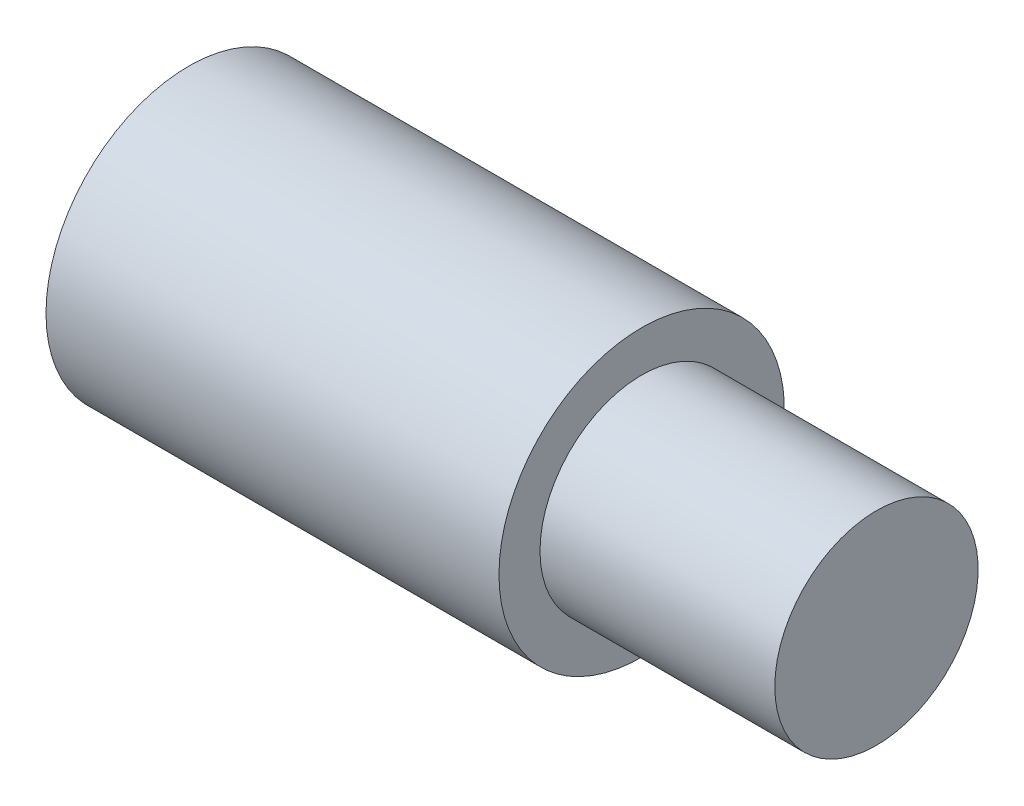
ISO-10303-21;
HEADER;
FILE_DESCRIPTION(('STEP AP214'),'2;1');
FILE_NAME('part.step','',(''),(''),'','','');
FILE_SCHEMA(('AUTOMOTIVE_DESIGN { 1 0 10303 214 1 1 1 1 }'));
ENDSEC;
DATA;
#1=APPLICATION_CONTEXT('core data for automotive mechanical design processes');
#2=APPLICATION_PROTOCOL_DEFINITION('international standard','automotive_design',2000,#1);
#3=PRODUCT_CONTEXT('',#1,'mechanical');
#4=PRODUCT('Part','Part','',(#3));
#5=PRODUCT_RELATED_PRODUCT_CATEGORY('part','',(#4));
#6=PRODUCT_DEFINITION_FORMATION('','',#4);
#7=PRODUCT_DEFINITION_CONTEXT('part definition',#1,'design');
#8=PRODUCT_DEFINITION('design','',#6,#7);
#9=PRODUCT_DEFINITION_SHAPE('','',#8);
#10=(LENGTH_UNIT() NAMED_UNIT(*) SI_UNIT(.MILLI.,.METRE.));
#11=(NAMED_UNIT(*) PLANE_ANGLE_UNIT() SI_UNIT($,.RADIAN.));
#12=(NAMED_UNIT(*) SI_UNIT($,.STERADIAN.) SOLID_ANGLE_UNIT());
#13=UNCERTAINTY_MEASURE_WITH_UNIT(LENGTH_MEASURE(1.E-05),#10,'distance_accuracy_value','');
#14=(GEOMETRIC_REPRESENTATION_CONTEXT(3) GLOBAL_UNCERTAINTY_ASSIGNED_CONTEXT((#13)) GLOBAL_UNIT_ASSIGNED_CONTEXT((#10,
#11,#12)) REPRESENTATION_CONTEXT('',''));
#15=CARTESIAN_POINT('',(0.,0.,0.));
#16=DIRECTION('',(0.,0.,1.));
#17=DIRECTION('',(1.,0.,0.));
#18=AXIS2_PLACEMENT_3D('',#15,#16,#17);
#19=CARTESIAN_POINT('',(12.7,0.,0.));
#20=DIRECTION('',(-1.,0.,0.));
#21=DIRECTION('',(0.,0.,1.));
#22=AXIS2_PLACEMENT_3D('',#19,#20,#21);
#23=PLANE('',#22);
#24=CARTESIAN_POINT('',(12.6999999999999,0.,0.));
#25=DIRECTION('',(-1.,0.,0.));
#26=DIRECTION('',(0.,0.,1.));
#27=AXIS2_PLACEMENT_3D('',#24,#25,#26);
#28=CIRCLE('',#27,5.5);
#29=CARTESIAN_POINT('',(12.6999999999999,0.,5.5));
#30=VERTEX_POINT('',#29);
#31=EDGE_CURVE('E10',#30,#30,#28,.T.);
#32=ORIENTED_EDGE('',*,*,#31,.F.);
#33=EDGE_LOOP('',(#32));
#34=FACE_BOUND('',#33,.T.);
#35=ADVANCED_FACE('F39',(#34),#23,.F.);
#36=CARTESIAN_POINT('',(-1000.,0.,0.));
#37=DIRECTION('',(-1.,0.,0.));
#38=DIRECTION('',(0.,0.,1.));
#39=AXIS2_PLACEMENT_3D('',#36,#37,#38);
#40=CYLINDRICAL_SURFACE('',#39,5.5);
#41=CARTESIAN_POINT('',(0.,0.,0.));
#42=DIRECTION('',(-1.,0.,0.));
#43=DIRECTION('',(0.,0.,1.));
#44=AXIS2_PLACEMENT_3D('',#41,#42,#43);
#45=CIRCLE('',#44,5.5);
#46=CARTESIAN_POINT('',(0.,0.,5.5));
#47=VERTEX_POINT('',#46);
#48=EDGE_CURVE('E46',#47,#47,#45,.T.);
#49=ORIENTED_EDGE('',*,*,#48,.F.);
#50=EDGE_LOOP('',(#49));
#51=FACE_BOUND('',#50,.T.);
#52=ORIENTED_EDGE('',*,*,#31,.T.);
#53=EDGE_LOOP('',(#52));
#54=FACE_BOUND('',#53,.T.);
#55=ADVANCED_FACE('F84',(#51,#54),#40,.T.);
#56=CARTESIAN_POINT('',(0.,5.5,0.));
#57=DIRECTION('',(-1.,0.,0.));
#58=DIRECTION('',(0.,0.,1.));
#59=AXIS2_PLACEMENT_3D('',#56,#57,#58);
#60=PLANE('',#59);
#61=CARTESIAN_POINT('',(0.,0.,0.));
#62=DIRECTION('',(-1.,0.,0.));
#63=DIRECTION('',(0.,0.,1.));
#64=AXIS2_PLACEMENT_3D('',#61,#62,#63);
#65=CIRCLE('',#64,7.72);
#66=CARTESIAN_POINT('',(0.,0.,7.72));
#67=VERTEX_POINT('',#66);
#68=EDGE_CURVE('E49',#67,#67,#65,.T.);
#69=ORIENTED_EDGE('',*,*,#68,.F.);
#70=EDGE_LOOP('',(#69));
#71=FACE_BOUND('',#70,.T.);
#72=ORIENTED_EDGE('',*,*,#48,.T.);
#73=EDGE_LOOP('',(#72));
#74=FACE_BOUND('',#73,.T.);
#75=ADVANCED_FACE('F76',(#71,#74),#60,.F.);
#76=CARTESIAN_POINT('',(-1000.,0.,0.));
#77=DIRECTION('',(-1.,0.,0.));
#78=DIRECTION('',(0.,0.,1.));
#79=AXIS2_PLACEMENT_3D('',#76,#77,#78);
#80=CYLINDRICAL_SURFACE('',#79,7.72);
#81=CARTESIAN_POINT('',(-24.5,0.,0.));
#82=DIRECTION('',(-1.,0.,0.));
#83=DIRECTION('',(0.,0.,1.));
#84=AXIS2_PLACEMENT_3D('',#81,#82,#83);
#85=CIRCLE('',#84,7.72);
#86=CARTESIAN_POINT('',(-24.5,0.,7.72));
#87=VERTEX_POINT('',#86);
#88=EDGE_CURVE('E54',#87,#87,#85,.T.);
#89=ORIENTED_EDGE('',*,*,#88,.F.);
#90=EDGE_LOOP('',(#89));
#91=FACE_BOUND('',#90,.T.);
#92=ORIENTED_EDGE('',*,*,#68,.T.);
#93=EDGE_LOOP('',(#92));
#94=FACE_BOUND('',#93,.T.);
#95=ADVANCED_FACE('F68',(#91,#94),#80,.T.);
#96=CARTESIAN_POINT('',(-24.5,7.72,0.));
#97=DIRECTION('',(1.,0.,0.));
#98=DIRECTION('',(0.,0.,-1.));
#99=AXIS2_PLACEMENT_3D('',#96,#97,#98);
#100=PLANE('',#99);
#101=CARTESIAN_POINT('',(-24.5,0.,0.));
#102=DIRECTION('',(1.,0.,0.));
#103=DIRECTION('',(0.,0.,-1.));
#104=AXIS2_PLACEMENT_3D('',#101,#102,#103);
#105=CIRCLE('',#104,3.175);
#106=CARTESIAN_POINT('',(-24.5,0.,-3.175));
#107=VERTEX_POINT('',#106);
#108=EDGE_CURVE('E45',#107,#107,#105,.F.);
#109=ORIENTED_EDGE('',*,*,#108,.F.);
#110=EDGE_LOOP('',(#109));
#111=FACE_BOUND('',#110,.T.);
#112=ORIENTED_EDGE('',*,*,#88,.T.);
#113=EDGE_LOOP('',(#112));
#114=FACE_BOUND('',#113,.T.);
#115=ADVANCED_FACE('F69',(#111,#114),#100,.F.);
#116=CARTESIAN_POINT('',(-1000.,0.,0.));
#117=DIRECTION('',(-1.,0.,0.));
#118=DIRECTION('',(0.,0.,1.));
#119=AXIS2_PLACEMENT_3D('',#116,#117,#118);
#120=CYLINDRICAL_SURFACE('',#119,3.175);
#121=CARTESIAN_POINT('',(-9.29999999999998,0.,0.));
#122=DIRECTION('',(-1.,0.,0.));
#123=DIRECTION('',(0.,0.,1.));
#124=AXIS2_PLACEMENT_3D('',#121,#122,#123);
#125=CIRCLE('',#124,3.175);
#126=CARTESIAN_POINT('',(-9.29999999999998,0.,3.175));
#127=VERTEX_POINT('',#126);
#128=EDGE_CURVE('E59',#127,#127,#125,.T.);
#129=ORIENTED_EDGE('',*,*,#128,.F.);
#130=EDGE_LOOP('',(#129));
#131=FACE_BOUND('',#130,.T.);
#132=ORIENTED_EDGE('',*,*,#108,.T.);
#133=EDGE_LOOP('',(#132));
#134=FACE_BOUND('',#133,.T.);
#135=ADVANCED_FACE('F64',(#131,#134),#120,.F.);
#136=CARTESIAN_POINT('',(-9.3,3.175,0.));
#137=DIRECTION('',(-1.,0.,0.));
#138=DIRECTION('',(0.,0.,1.));
#139=AXIS2_PLACEMENT_3D('',#136,#137,#138);
#140=PLANE('',#139);
#141=ORIENTED_EDGE('',*,*,#128,.T.);
#142=EDGE_LOOP('',(#141));
#143=FACE_BOUND('',#142,.T.);
#144=ADVANCED_FACE('F94',(#143),#140,.T.);
#145=CLOSED_SHELL('',(#35,#55,#75,#95,#115,#135,#144));
#146=MANIFOLD_SOLID_BREP('B2',#145);
#147=ADVANCED_BREP_SHAPE_REPRESENTATION('',(#18,#146),#14);
#148=SHAPE_DEFINITION_REPRESENTATION(#9,#147);
ENDSEC;
END-ISO-10303-21;
